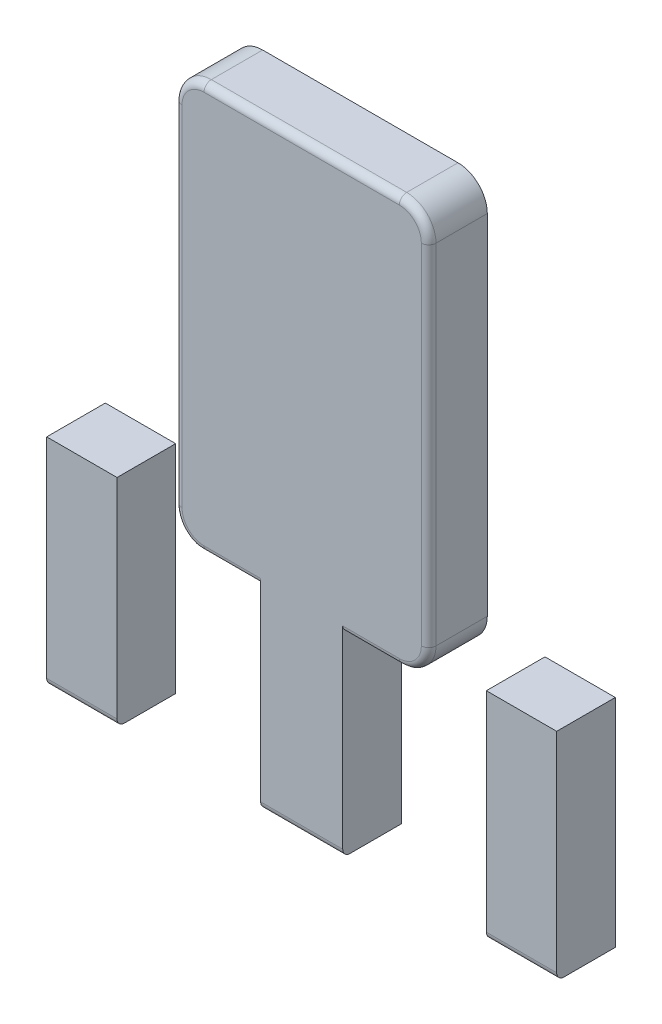
ISO-10303-21;
HEADER;
FILE_DESCRIPTION(('STEP AP214'),'2;1');
FILE_NAME('part.step','',(''),(''),'','','');
FILE_SCHEMA(('AUTOMOTIVE_DESIGN { 1 0 10303 214 1 1 1 1 }'));
ENDSEC;
DATA;
#1=APPLICATION_CONTEXT('core data for automotive mechanical design processes');
#2=APPLICATION_PROTOCOL_DEFINITION('international standard','automotive_design',2000,#1);
#3=PRODUCT_CONTEXT('',#1,'mechanical');
#4=PRODUCT('Part','Part','',(#3));
#5=PRODUCT_RELATED_PRODUCT_CATEGORY('part','',(#4));
#6=PRODUCT_DEFINITION_FORMATION('','',#4);
#7=PRODUCT_DEFINITION_CONTEXT('part definition',#1,'design');
#8=PRODUCT_DEFINITION('design','',#6,#7);
#9=PRODUCT_DEFINITION_SHAPE('','',#8);
#10=(LENGTH_UNIT() NAMED_UNIT(*) SI_UNIT(.MILLI.,.METRE.));
#11=(NAMED_UNIT(*) PLANE_ANGLE_UNIT() SI_UNIT($,.RADIAN.));
#12=(NAMED_UNIT(*) SI_UNIT($,.STERADIAN.) SOLID_ANGLE_UNIT());
#13=UNCERTAINTY_MEASURE_WITH_UNIT(LENGTH_MEASURE(1.E-05),#10,'distance_accuracy_value','');
#14=(GEOMETRIC_REPRESENTATION_CONTEXT(3) GLOBAL_UNCERTAINTY_ASSIGNED_CONTEXT((#13)) GLOBAL_UNIT_ASSIGNED_CONTEXT((#10,
#11,#12)) REPRESENTATION_CONTEXT('',''));
#15=CARTESIAN_POINT('',(0.,0.,0.));
#16=DIRECTION('',(0.,0.,1.));
#17=DIRECTION('',(1.,0.,0.));
#18=AXIS2_PLACEMENT_3D('',#15,#16,#17);
#19=CARTESIAN_POINT('',(27.87499984,24.870008478953,0.4));
#20=DIRECTION('',(0.,0.,1.));
#21=DIRECTION('',(1.,0.,0.));
#22=AXIS2_PLACEMENT_3D('',#19,#20,#21);
#23=PLANE('',#22);
#24=DIRECTION('',(1.,0.,0.));
#25=VECTOR('',#24,1.);
#26=CARTESIAN_POINT('',(27.87499984,23.53002147107,0.4));
#27=LINE('',#26,#25);
#28=CARTESIAN_POINT('',(27.20849984,23.53002147107,0.4));
#29=VERTEX_POINT('',#28);
#30=CARTESIAN_POINT('',(27.59499984,23.53002147107,0.4));
#31=VERTEX_POINT('',#30);
#32=EDGE_CURVE('P0_E169',#29,#31,#27,.T.);
#33=ORIENTED_EDGE('',*,*,#32,.T.);
#34=DIRECTION('',(0.,1.,0.));
#35=VECTOR('',#34,1.);
#36=CARTESIAN_POINT('',(27.59499984,24.870008478953,0.4));
#37=LINE('',#36,#35);
#38=CARTESIAN_POINT('',(27.59499984,22.209995486836,0.4));
#39=VERTEX_POINT('',#38);
#40=EDGE_CURVE('P0_E151',#31,#39,#37,.F.);
#41=ORIENTED_EDGE('',*,*,#40,.T.);
#42=DIRECTION('',(1.,0.,0.));
#43=VECTOR('',#42,1.);
#44=CARTESIAN_POINT('',(27.87499984,22.209995486836,0.4));
#45=LINE('',#44,#43);
#46=CARTESIAN_POINT('',(28.15499984,22.209995486836,0.4));
#47=VERTEX_POINT('',#46);
#48=EDGE_CURVE('P0_E144',#39,#47,#45,.T.);
#49=ORIENTED_EDGE('',*,*,#48,.T.);
#50=DIRECTION('',(0.,1.,0.));
#51=VECTOR('',#50,1.);
#52=CARTESIAN_POINT('',(28.15499984,24.870008478953,0.4));
#53=LINE('',#52,#51);
#54=CARTESIAN_POINT('',(28.15499984,23.53002147107,0.4));
#55=VERTEX_POINT('',#54);
#56=EDGE_CURVE('P0_E148',#47,#55,#53,.T.);
#57=ORIENTED_EDGE('',*,*,#56,.T.);
#58=DIRECTION('',(1.,0.,0.));
#59=VECTOR('',#58,1.);
#60=CARTESIAN_POINT('',(27.44174984,23.53002147107,0.4));
#61=LINE('',#60,#59);
#62=CARTESIAN_POINT('',(28.54149984,23.53002147107,0.4));
#63=VERTEX_POINT('',#62);
#64=EDGE_CURVE('P0_E176',#63,#55,#61,.F.);
#65=ORIENTED_EDGE('',*,*,#64,.F.);
#66=CARTESIAN_POINT('',(28.54149984,23.68002147107,0.4));
#67=DIRECTION('',(0.,0.,-1.));
#68=DIRECTION('',(1.,0.,0.));
#69=AXIS2_PLACEMENT_3D('',#66,#67,#68);
#70=CIRCLE('',#69,0.149999999999997);
#71=CARTESIAN_POINT('',(28.69149984,23.68002147107,0.4));
#72=VERTEX_POINT('',#71);
#73=EDGE_CURVE('P0_E512',#72,#63,#70,.T.);
#74=ORIENTED_EDGE('',*,*,#73,.F.);
#75=DIRECTION('',(0.,1.,0.));
#76=VECTOR('',#75,1.);
#77=CARTESIAN_POINT('',(28.69149984,24.175014975011,0.4));
#78=LINE('',#77,#76);
#79=CARTESIAN_POINT('',(28.69149984,26.059995486836,0.4));
#80=VERTEX_POINT('',#79);
#81=EDGE_CURVE('P0_E260',#80,#72,#78,.F.);
#82=ORIENTED_EDGE('',*,*,#81,.F.);
#83=CARTESIAN_POINT('',(28.54149984,26.059995486836,0.4));
#84=DIRECTION('',(0.,0.,-1.));
#85=DIRECTION('',(0.,1.,0.));
#86=AXIS2_PLACEMENT_3D('',#83,#84,#85);
#87=CIRCLE('',#86,0.150000000000001);
#88=CARTESIAN_POINT('',(28.54149984,26.209995486836,0.4));
#89=VERTEX_POINT('',#88);
#90=EDGE_CURVE('P0_E275',#89,#80,#87,.T.);
#91=ORIENTED_EDGE('',*,*,#90,.F.);
#92=DIRECTION('',(-1.,0.,0.));
#93=VECTOR('',#92,1.);
#94=CARTESIAN_POINT('',(28.30824984,26.209995486836,0.4));
#95=LINE('',#94,#93);
#96=CARTESIAN_POINT('',(27.20849984,26.209995486836,0.4));
#97=VERTEX_POINT('',#96);
#98=EDGE_CURVE('P0_E297',#97,#89,#95,.F.);
#99=ORIENTED_EDGE('',*,*,#98,.F.);
#100=CARTESIAN_POINT('',(27.20849984,26.059995486836,0.4));
#101=DIRECTION('',(0.,0.,-1.));
#102=DIRECTION('',(-1.,0.,0.));
#103=AXIS2_PLACEMENT_3D('',#100,#101,#102);
#104=CIRCLE('',#103,0.150000000000001);
#105=CARTESIAN_POINT('',(27.05849984,26.059995486836,0.4));
#106=VERTEX_POINT('',#105);
#107=EDGE_CURVE('P0_E543',#106,#97,#104,.T.);
#108=ORIENTED_EDGE('',*,*,#107,.F.);
#109=DIRECTION('',(0.,-1.,0.));
#110=VECTOR('',#109,1.);
#111=CARTESIAN_POINT('',(27.05849984,25.565001982894,0.4));
#112=LINE('',#111,#110);
#113=CARTESIAN_POINT('',(27.05849984,23.68002147107,0.4));
#114=VERTEX_POINT('',#113);
#115=EDGE_CURVE('P0_E234',#114,#106,#112,.F.);
#116=ORIENTED_EDGE('',*,*,#115,.F.);
#117=CARTESIAN_POINT('',(27.20849984,23.68002147107,0.4));
#118=DIRECTION('',(0.,0.,-1.));
#119=DIRECTION('',(0.,-1.,0.));
#120=AXIS2_PLACEMENT_3D('',#117,#118,#119);
#121=CIRCLE('',#120,0.149999999999997);
#122=EDGE_CURVE('P0_E167',#114,#29,#121,.F.);
#123=ORIENTED_EDGE('',*,*,#122,.T.);
#124=EDGE_LOOP('',(#33,#41,#49,#57,#65,#74,#82,#91,#99,#108,#116,#123));
#125=FACE_BOUND('',#124,.T.);
#126=ADVANCED_FACE('P0_F17',(#125),#23,.T.);
#127=CARTESIAN_POINT('',(27.44174984,23.53002147107,0.35));
#128=DIRECTION('',(1.,0.,0.));
#129=DIRECTION('',(0.,1.,0.));
#130=AXIS2_PLACEMENT_3D('',#127,#128,#129);
#131=CYLINDRICAL_SURFACE('',#130,0.05);
#132=ORIENTED_EDGE('',*,*,#64,.T.);
#133=CARTESIAN_POINT('',(28.15499984,23.53002147107,0.35));
#134=DIRECTION('',(1.,0.,0.));
#135=DIRECTION('',(0.,1.,0.));
#136=AXIS2_PLACEMENT_3D('',#133,#134,#135);
#137=CIRCLE('',#136,0.05);
#138=CARTESIAN_POINT('',(28.15499984,23.51002147107,0.395825756949779));
#139=VERTEX_POINT('',#138);
#140=EDGE_CURVE('P0_E166',#139,#55,#137,.F.);
#141=ORIENTED_EDGE('',*,*,#140,.F.);
#142=DIRECTION('',(1.,0.,0.));
#143=VECTOR('',#142,1.);
#144=CARTESIAN_POINT('',(28.15499984,23.51002147107,0.39582575695));
#145=LINE('',#144,#143);
#146=CARTESIAN_POINT('',(28.54149984,23.51002147107,0.395825756949779));
#147=VERTEX_POINT('',#146);
#148=EDGE_CURVE('P0_E327',#139,#147,#145,.T.);
#149=ORIENTED_EDGE('',*,*,#148,.T.);
#150=CARTESIAN_POINT('',(28.54149984,23.53002147107,0.35));
#151=DIRECTION('',(-1.,0.,0.));
#152=DIRECTION('',(0.,-1.,0.));
#153=AXIS2_PLACEMENT_3D('',#150,#151,#152);
#154=CIRCLE('',#153,0.05);
#155=EDGE_CURVE('P0_E268',#63,#147,#154,.F.);
#156=ORIENTED_EDGE('',*,*,#155,.F.);
#157=EDGE_LOOP('',(#132,#141,#149,#156));
#158=FACE_BOUND('',#157,.T.);
#159=ADVANCED_FACE('P0_F316',(#158),#131,.T.);
#160=CARTESIAN_POINT('',(28.54149984,23.68002147107,0.35));
#161=DIRECTION('',(0.,0.,-1.));
#162=DIRECTION('',(-1.,0.,0.));
#163=AXIS2_PLACEMENT_3D('',#160,#161,#162);
#164=TOROIDAL_SURFACE('',#163,0.150000000000001,0.05);
#165=ORIENTED_EDGE('',*,*,#73,.T.);
#166=ORIENTED_EDGE('',*,*,#155,.T.);
#167=CARTESIAN_POINT('',(28.54149984,23.51002147107,0.39582575694956));
#168=CARTESIAN_POINT('',(28.5454670463507,23.5100214710703,0.395823925661226));
#169=CARTESIAN_POINT('',(28.549433265949,23.5100214710701,0.39576557854478));
#170=CARTESIAN_POINT('',(28.557367116511,23.5100214710699,0.395518295345289));
#171=CARTESIAN_POINT('',(28.5613347416206,23.5100214710697,0.395329175797031));
#172=CARTESIAN_POINT('',(28.573373720192,23.5100214710706,0.394529786552662));
#173=CARTESIAN_POINT('',(28.5814350459597,23.510021471073,0.393686164947034));
#174=CARTESIAN_POINT('',(28.5943958248497,23.510021471072,0.39147124781918));
#175=CARTESIAN_POINT('',(28.5993461998738,23.5100214710705,0.390416929183707));
#176=CARTESIAN_POINT('',(28.6090662806014,23.5100214710695,0.38773144048353));
#177=CARTESIAN_POINT('',(28.6138367690784,23.51002147107,0.386103195317195));
#178=CARTESIAN_POINT('',(28.6237453393678,23.5100214710704,0.381715010684801));
#179=CARTESIAN_POINT('',(28.628831020054,23.5100214710701,0.378821829297902));
#180=CARTESIAN_POINT('',(28.6366839229633,23.5100214710699,0.372404905570367));
#181=CARTESIAN_POINT('',(28.6397120957729,23.51002147107,0.369226620121918));
#182=CARTESIAN_POINT('',(28.6438482586086,23.51002147107,0.362776914775868));
#183=CARTESIAN_POINT('',(28.6452393854319,23.51002147107,0.359700146098907));
#184=CARTESIAN_POINT('',(28.6465872508968,23.51002147107,0.354370083119612));
#185=CARTESIAN_POINT('',(28.6468718238064,23.51002147107,0.352194992673776));
#186=CARTESIAN_POINT('',(28.6468563775285,23.51002147107,0.35));
#187=B_SPLINE_CURVE_WITH_KNOTS('',3,(#167,#168,#169,#170,#171,#172,#173,#174,#175,#176,#177,
#178,#179,#180,#181,#182,#183,#184,#185,#186),.UNSPECIFIED.,.F.,.F.,(4,2,2,2,2,2,2,2,2,4),(0.,
0.011898983462492,0.0238146943840628,0.0480839145131784,0.0632424571003176,0.0783248383911586,
0.0956724692605174,0.10862506220778,0.118556370768383,0.125091474785209),.UNSPECIFIED.);
#188=CARTESIAN_POINT('',(28.6468563775287,23.5100214710701,0.35));
#189=VERTEX_POINT('',#188);
#190=EDGE_CURVE('P0_E320',#147,#189,#187,.T.);
#191=ORIENTED_EDGE('',*,*,#190,.T.);
#192=CARTESIAN_POINT('',(28.54149984,23.68002147107,0.35));
#193=DIRECTION('',(0.,0.,1.));
#194=DIRECTION('',(1.,0.,0.));
#195=AXIS2_PLACEMENT_3D('',#192,#193,#194);
#196=CIRCLE('',#195,0.2);
#197=CARTESIAN_POINT('',(28.74149984,23.68002147107,0.35));
#198=VERTEX_POINT('',#197);
#199=EDGE_CURVE('P0_E300',#198,#189,#196,.F.);
#200=ORIENTED_EDGE('',*,*,#199,.F.);
#201=CARTESIAN_POINT('',(28.69149984,23.68002147107,0.35));
#202=DIRECTION('',(0.,1.,0.));
#203=DIRECTION('',(-1.,0.,0.));
#204=AXIS2_PLACEMENT_3D('',#201,#202,#203);
#205=CIRCLE('',#204,0.05);
#206=EDGE_CURVE('P0_E267',#72,#198,#205,.T.);
#207=ORIENTED_EDGE('',*,*,#206,.F.);
#208=EDGE_LOOP('',(#165,#166,#191,#200,#207));
#209=FACE_BOUND('',#208,.T.);
#210=ADVANCED_FACE('P0_F313',(#209),#164,.T.);
#211=CARTESIAN_POINT('',(28.69149984,24.175014975011,0.35));
#212=DIRECTION('',(0.,1.,0.));
#213=DIRECTION('',(-1.,0.,0.));
#214=AXIS2_PLACEMENT_3D('',#211,#212,#213);
#215=CYLINDRICAL_SURFACE('',#214,0.05);
#216=ORIENTED_EDGE('',*,*,#206,.T.);
#217=DIRECTION('',(0.,1.,0.));
#218=VECTOR('',#217,1.);
#219=CARTESIAN_POINT('',(28.74149984,23.48002147107,0.35));
#220=LINE('',#219,#218);
#221=CARTESIAN_POINT('',(28.74149984,26.059995486836,0.35));
#222=VERTEX_POINT('',#221);
#223=EDGE_CURVE('P0_E303',#222,#198,#220,.F.);
#224=ORIENTED_EDGE('',*,*,#223,.F.);
#225=CARTESIAN_POINT('',(28.69149984,26.059995486836,0.35));
#226=DIRECTION('',(0.,-1.,0.));
#227=DIRECTION('',(1.,0.,0.));
#228=AXIS2_PLACEMENT_3D('',#225,#226,#227);
#229=CIRCLE('',#228,0.05);
#230=EDGE_CURVE('P0_E295',#80,#222,#229,.F.);
#231=ORIENTED_EDGE('',*,*,#230,.F.);
#232=ORIENTED_EDGE('',*,*,#81,.T.);
#233=EDGE_LOOP('',(#216,#224,#231,#232));
#234=FACE_BOUND('',#233,.T.);
#235=ADVANCED_FACE('P0_F289',(#234),#215,.T.);
#236=CARTESIAN_POINT('',(28.54149984,26.059995486836,0.35));
#237=DIRECTION('',(0.,0.,-1.));
#238=DIRECTION('',(-1.,0.,0.));
#239=AXIS2_PLACEMENT_3D('',#236,#237,#238);
#240=TOROIDAL_SURFACE('',#239,0.150000000000001,0.05);
#241=ORIENTED_EDGE('',*,*,#230,.T.);
#242=CARTESIAN_POINT('',(28.54149984,26.059995486836,0.35));
#243=DIRECTION('',(0.,0.,1.));
#244=DIRECTION('',(1.,0.,0.));
#245=AXIS2_PLACEMENT_3D('',#242,#243,#244);
#246=CIRCLE('',#245,0.2);
#247=CARTESIAN_POINT('',(28.54149984,26.259995486836,0.35));
#248=VERTEX_POINT('',#247);
#249=EDGE_CURVE('P0_E455',#248,#222,#246,.F.);
#250=ORIENTED_EDGE('',*,*,#249,.F.);
#251=CARTESIAN_POINT('',(28.54149984,26.209995486836,0.35));
#252=DIRECTION('',(-1.,0.,0.));
#253=DIRECTION('',(0.,-1.,0.));
#254=AXIS2_PLACEMENT_3D('',#251,#252,#253);
#255=CIRCLE('',#254,0.05);
#256=EDGE_CURVE('P0_E564',#89,#248,#255,.T.);
#257=ORIENTED_EDGE('',*,*,#256,.F.);
#258=ORIENTED_EDGE('',*,*,#90,.T.);
#259=EDGE_LOOP('',(#241,#250,#257,#258));
#260=FACE_BOUND('',#259,.T.);
#261=ADVANCED_FACE('P0_F279',(#260),#240,.T.);
#262=CARTESIAN_POINT('',(28.30824984,26.209995486836,0.35));
#263=DIRECTION('',(-1.,0.,0.));
#264=DIRECTION('',(0.,-1.,0.));
#265=AXIS2_PLACEMENT_3D('',#262,#263,#264);
#266=CYLINDRICAL_SURFACE('',#265,0.05);
#267=ORIENTED_EDGE('',*,*,#256,.T.);
#268=DIRECTION('',(-1.,0.,0.));
#269=VECTOR('',#268,1.);
#270=CARTESIAN_POINT('',(28.74149984,26.259995486836,0.35));
#271=LINE('',#270,#269);
#272=CARTESIAN_POINT('',(27.20849984,26.259995486836,0.35));
#273=VERTEX_POINT('',#272);
#274=EDGE_CURVE('P0_E237',#273,#248,#271,.F.);
#275=ORIENTED_EDGE('',*,*,#274,.F.);
#276=CARTESIAN_POINT('',(27.20849984,26.209995486836,0.35));
#277=DIRECTION('',(1.,0.,0.));
#278=DIRECTION('',(0.,1.,0.));
#279=AXIS2_PLACEMENT_3D('',#276,#277,#278);
#280=CIRCLE('',#279,0.05);
#281=EDGE_CURVE('P0_E245',#97,#273,#280,.F.);
#282=ORIENTED_EDGE('',*,*,#281,.F.);
#283=ORIENTED_EDGE('',*,*,#98,.T.);
#284=EDGE_LOOP('',(#267,#275,#282,#283));
#285=FACE_BOUND('',#284,.T.);
#286=ADVANCED_FACE('P0_F251',(#285),#266,.T.);
#287=CARTESIAN_POINT('',(27.20849984,26.059995486836,0.35));
#288=DIRECTION('',(0.,0.,-1.));
#289=DIRECTION('',(-1.,0.,0.));
#290=AXIS2_PLACEMENT_3D('',#287,#288,#289);
#291=TOROIDAL_SURFACE('',#290,0.150000000000001,0.05);
#292=ORIENTED_EDGE('',*,*,#281,.T.);
#293=CARTESIAN_POINT('',(27.20849984,26.059995486836,0.35));
#294=DIRECTION('',(0.,0.,1.));
#295=DIRECTION('',(1.,0.,0.));
#296=AXIS2_PLACEMENT_3D('',#293,#294,#295);
#297=CIRCLE('',#296,0.2);
#298=CARTESIAN_POINT('',(27.00849984,26.059995486836,0.35));
#299=VERTEX_POINT('',#298);
#300=EDGE_CURVE('P0_E227',#299,#273,#297,.F.);
#301=ORIENTED_EDGE('',*,*,#300,.F.);
#302=CARTESIAN_POINT('',(27.05849984,26.059995486836,0.35));
#303=DIRECTION('',(0.,-1.,0.));
#304=DIRECTION('',(1.,0.,0.));
#305=AXIS2_PLACEMENT_3D('',#302,#303,#304);
#306=CIRCLE('',#305,0.05);
#307=EDGE_CURVE('P0_E224',#106,#299,#306,.T.);
#308=ORIENTED_EDGE('',*,*,#307,.F.);
#309=ORIENTED_EDGE('',*,*,#107,.T.);
#310=EDGE_LOOP('',(#292,#301,#308,#309));
#311=FACE_BOUND('',#310,.T.);
#312=ADVANCED_FACE('P0_F247',(#311),#291,.T.);
#313=CARTESIAN_POINT('',(27.05849984,25.565001982894,0.35));
#314=DIRECTION('',(0.,-1.,0.));
#315=DIRECTION('',(1.,0.,0.));
#316=AXIS2_PLACEMENT_3D('',#313,#314,#315);
#317=CYLINDRICAL_SURFACE('',#316,0.05);
#318=ORIENTED_EDGE('',*,*,#307,.T.);
#319=DIRECTION('',(0.,-1.,0.));
#320=VECTOR('',#319,1.);
#321=CARTESIAN_POINT('',(27.00849984,26.259995486836,0.35));
#322=LINE('',#321,#320);
#323=CARTESIAN_POINT('',(27.00849984,23.68002147107,0.35));
#324=VERTEX_POINT('',#323);
#325=EDGE_CURVE('P0_E215',#324,#299,#322,.F.);
#326=ORIENTED_EDGE('',*,*,#325,.F.);
#327=CARTESIAN_POINT('',(27.05849984,23.68002147107,0.35));
#328=DIRECTION('',(0.,1.,0.));
#329=DIRECTION('',(-1.,0.,0.));
#330=AXIS2_PLACEMENT_3D('',#327,#328,#329);
#331=CIRCLE('',#330,0.05);
#332=EDGE_CURVE('P0_E221',#114,#324,#331,.F.);
#333=ORIENTED_EDGE('',*,*,#332,.F.);
#334=ORIENTED_EDGE('',*,*,#115,.T.);
#335=EDGE_LOOP('',(#318,#326,#333,#334));
#336=FACE_BOUND('',#335,.T.);
#337=ADVANCED_FACE('P0_F199',(#336),#317,.T.);
#338=CARTESIAN_POINT('',(27.20849984,23.68002147107,0.35));
#339=DIRECTION('',(0.,0.,-1.));
#340=DIRECTION('',(-1.,0.,0.));
#341=AXIS2_PLACEMENT_3D('',#338,#339,#340);
#342=TOROIDAL_SURFACE('',#341,0.150000000000001,0.05);
#343=ORIENTED_EDGE('',*,*,#332,.T.);
#344=CARTESIAN_POINT('',(27.20849984,23.68002147107,0.35));
#345=DIRECTION('',(0.,0.,1.));
#346=DIRECTION('',(1.,0.,0.));
#347=AXIS2_PLACEMENT_3D('',#344,#345,#346);
#348=CIRCLE('',#347,0.2);
#349=CARTESIAN_POINT('',(27.1031433024712,23.51002147107,0.35));
#350=VERTEX_POINT('',#349);
#351=EDGE_CURVE('P0_E208',#350,#324,#348,.F.);
#352=ORIENTED_EDGE('',*,*,#351,.F.);
#353=CARTESIAN_POINT('',(27.1031433024715,23.51002147107,0.35));
#354=CARTESIAN_POINT('',(27.1031181051512,23.51002147107,0.35313881546828));
#355=CARTESIAN_POINT('',(27.1036982612725,23.51002147107,0.356201353341664));
#356=CARTESIAN_POINT('',(27.1057756542494,23.51002147107,0.361996908477458));
#357=CARTESIAN_POINT('',(27.1072692396793,23.51002147107,0.364731186155528));
#358=CARTESIAN_POINT('',(27.1118848929716,23.51002147107,0.371101914034418));
#359=CARTESIAN_POINT('',(27.1154507453115,23.51002147107,0.374399837475452));
#360=CARTESIAN_POINT('',(27.1225000186428,23.51002147107,0.379452995833241));
#361=CARTESIAN_POINT('',(27.1258730396514,23.51002147107,0.381381662009323));
#362=CARTESIAN_POINT('',(27.132891415033,23.51002147107,0.384741875614142));
#363=CARTESIAN_POINT('',(27.1365388720196,23.51002147107,0.386168980374011));
#364=CARTESIAN_POINT('',(27.1458626233454,23.51002147107,0.389253734638291));
#365=CARTESIAN_POINT('',(27.1516203728115,23.51002147107,0.390654486589262));
#366=CARTESIAN_POINT('',(27.1632625393431,23.51002147107,0.392859347211519));
#367=CARTESIAN_POINT('',(27.1691473933054,23.51002147107,0.393660874762383));
#368=CARTESIAN_POINT('',(27.180632359305,23.51002147107,0.394827565118396));
#369=CARTESIAN_POINT('',(27.18623045657,23.51002147107,0.39521418147571));
#370=CARTESIAN_POINT('',(27.1973869996319,23.51002147107,0.395706358913322));
#371=CARTESIAN_POINT('',(27.202945324381,23.51002147107,0.395814524089981));
#372=CARTESIAN_POINT('',(27.20849984,23.51002147107,0.39582575694956));
#373=B_SPLINE_CURVE_WITH_KNOTS('',3,(#353,#354,#355,#356,#357,#358,#359,#360,#361,#362,#363,
#364,#365,#366,#367,#368,#369,#370,#371,#372),.UNSPECIFIED.,.F.,.F.,(4,2,2,2,2,2,2,2,2,4),(0.,
0.00924367209698654,0.0184506320601541,0.032754510017067,0.0443707872529733,0.0560875077121733,
0.073811079442636,0.0916105612814064,0.108437297404244,0.125106087256074),.UNSPECIFIED.);
#374=CARTESIAN_POINT('',(27.20849984,23.51002147107,0.395825756949779));
#375=VERTEX_POINT('',#374);
#376=EDGE_CURVE('P0_E328',#350,#375,#373,.T.);
#377=ORIENTED_EDGE('',*,*,#376,.T.);
#378=CARTESIAN_POINT('',(27.20849984,23.53002147107,0.35));
#379=DIRECTION('',(1.,0.,0.));
#380=DIRECTION('',(0.,1.,0.));
#381=AXIS2_PLACEMENT_3D('',#378,#379,#380);
#382=CIRCLE('',#381,0.05);
#383=EDGE_CURVE('P0_E223',#29,#375,#382,.T.);
#384=ORIENTED_EDGE('',*,*,#383,.F.);
#385=ORIENTED_EDGE('',*,*,#122,.F.);
#386=EDGE_LOOP('',(#343,#352,#377,#384,#385));
#387=FACE_BOUND('',#386,.T.);
#388=ADVANCED_FACE('P0_F188',(#387),#342,.T.);
#389=CARTESIAN_POINT('',(27.73499984,22.209995486836,0.35));
#390=DIRECTION('',(1.,0.,0.));
#391=DIRECTION('',(0.,1.,0.));
#392=AXIS2_PLACEMENT_3D('',#389,#390,#391);
#393=CYLINDRICAL_SURFACE('',#392,0.05);
#394=CARTESIAN_POINT('',(27.59499984,22.209995486836,0.35));
#395=DIRECTION('',(1.,0.,0.));
#396=DIRECTION('',(0.,1.,0.));
#397=AXIS2_PLACEMENT_3D('',#394,#395,#396);
#398=CIRCLE('',#397,0.05);
#399=CARTESIAN_POINT('',(27.59499984,22.159995486836,0.35));
#400=VERTEX_POINT('',#399);
#401=EDGE_CURVE('P0_E431',#400,#39,#398,.F.);
#402=ORIENTED_EDGE('',*,*,#401,.F.);
#403=DIRECTION('',(1.,0.,0.));
#404=VECTOR('',#403,1.);
#405=CARTESIAN_POINT('',(27.59499984,22.159995486836,0.35));
#406=LINE('',#405,#404);
#407=CARTESIAN_POINT('',(28.15499984,22.159995486836,0.35));
#408=VERTEX_POINT('',#407);
#409=EDGE_CURVE('P0_E159',#408,#400,#406,.F.);
#410=ORIENTED_EDGE('',*,*,#409,.F.);
#411=CARTESIAN_POINT('',(28.15499984,22.209995486836,0.35));
#412=DIRECTION('',(1.,0.,0.));
#413=DIRECTION('',(0.,1.,0.));
#414=AXIS2_PLACEMENT_3D('',#411,#412,#413);
#415=CIRCLE('',#414,0.05);
#416=EDGE_CURVE('P0_E21',#47,#408,#415,.T.);
#417=ORIENTED_EDGE('',*,*,#416,.F.);
#418=ORIENTED_EDGE('',*,*,#48,.F.);
#419=EDGE_LOOP('',(#402,#410,#417,#418));
#420=FACE_BOUND('',#419,.T.);
#421=ADVANCED_FACE('P0_F158',(#420),#393,.T.);
#422=CARTESIAN_POINT('',(27.44174984,23.53002147107,0.35));
#423=DIRECTION('',(1.,0.,0.));
#424=DIRECTION('',(0.,1.,0.));
#425=AXIS2_PLACEMENT_3D('',#422,#423,#424);
#426=CYLINDRICAL_SURFACE('',#425,0.05);
#427=ORIENTED_EDGE('',*,*,#32,.F.);
#428=ORIENTED_EDGE('',*,*,#383,.T.);
#429=DIRECTION('',(1.,0.,0.));
#430=VECTOR('',#429,1.);
#431=CARTESIAN_POINT('',(26.99499984,23.51002147107,0.39582575695));
#432=LINE('',#431,#430);
#433=CARTESIAN_POINT('',(27.59499984,23.51002147107,0.395825756949779));
#434=VERTEX_POINT('',#433);
#435=EDGE_CURVE('P0_E432',#375,#434,#432,.T.);
#436=ORIENTED_EDGE('',*,*,#435,.T.);
#437=CARTESIAN_POINT('',(27.59499984,23.53002147107,0.35));
#438=DIRECTION('',(1.,0.,0.));
#439=DIRECTION('',(0.,1.,0.));
#440=AXIS2_PLACEMENT_3D('',#437,#438,#439);
#441=CIRCLE('',#440,0.05);
#442=EDGE_CURVE('P0_E425',#31,#434,#441,.T.);
#443=ORIENTED_EDGE('',*,*,#442,.F.);
#444=EDGE_LOOP('',(#427,#428,#436,#443));
#445=FACE_BOUND('',#444,.T.);
#446=ADVANCED_FACE('P0_F347',(#445),#426,.T.);
#447=CARTESIAN_POINT('',(27.59499984,22.159995486836,0.));
#448=DIRECTION('',(0.,-1.,0.));
#449=DIRECTION('',(1.,0.,0.));
#450=AXIS2_PLACEMENT_3D('',#447,#448,#449);
#451=PLANE('',#450);
#452=DIRECTION('',(1.,0.,0.));
#453=VECTOR('',#452,1.);
#454=CARTESIAN_POINT('',(27.87499984,22.159995486836,0.));
#455=LINE('',#454,#453);
#456=CARTESIAN_POINT('',(27.59499984,22.159995486836,0.));
#457=VERTEX_POINT('',#456);
#458=CARTESIAN_POINT('',(28.15499984,22.159995486836,0.));
#459=VERTEX_POINT('',#458);
#460=EDGE_CURVE('P0_E424',#457,#459,#455,.T.);
#461=ORIENTED_EDGE('',*,*,#460,.T.);
#462=DIRECTION('',(0.,0.,1.));
#463=VECTOR('',#462,1.);
#464=CARTESIAN_POINT('',(28.15499984,22.159995486836,0.));
#465=LINE('',#464,#463);
#466=EDGE_CURVE('P0_E162',#408,#459,#465,.F.);
#467=ORIENTED_EDGE('',*,*,#466,.F.);
#468=ORIENTED_EDGE('',*,*,#409,.T.);
#469=DIRECTION('',(0.,0.,1.));
#470=VECTOR('',#469,1.);
#471=CARTESIAN_POINT('',(27.59499984,22.159995486836,0.));
#472=LINE('',#471,#470);
#473=EDGE_CURVE('P0_E428',#457,#400,#472,.T.);
#474=ORIENTED_EDGE('',*,*,#473,.F.);
#475=EDGE_LOOP('',(#461,#467,#468,#474));
#476=FACE_BOUND('',#475,.T.);
#477=ADVANCED_FACE('P0_F345',(#476),#451,.T.);
#478=CARTESIAN_POINT('',(28.15499984,22.159995486836,0.));
#479=DIRECTION('',(1.,0.,0.));
#480=DIRECTION('',(0.,1.,0.));
#481=AXIS2_PLACEMENT_3D('',#478,#479,#480);
#482=PLANE('',#481);
#483=DIRECTION('',(0.,0.,1.));
#484=VECTOR('',#483,1.);
#485=CARTESIAN_POINT('',(28.15499984,23.51002147107,0.));
#486=LINE('',#485,#484);
#487=CARTESIAN_POINT('',(28.15499984,23.51002147107,0.));
#488=VERTEX_POINT('',#487);
#489=EDGE_CURVE('P0_E464',#488,#139,#486,.T.);
#490=ORIENTED_EDGE('',*,*,#489,.T.);
#491=ORIENTED_EDGE('',*,*,#140,.T.);
#492=ORIENTED_EDGE('',*,*,#56,.F.);
#493=ORIENTED_EDGE('',*,*,#416,.T.);
#494=ORIENTED_EDGE('',*,*,#466,.T.);
#495=DIRECTION('',(0.,1.,0.));
#496=VECTOR('',#495,1.);
#497=CARTESIAN_POINT('',(28.15499984,22.898495486836,0.));
#498=LINE('',#497,#496);
#499=EDGE_CURVE('P0_E420',#459,#488,#498,.T.);
#500=ORIENTED_EDGE('',*,*,#499,.T.);
#501=EDGE_LOOP('',(#490,#491,#492,#493,#494,#500));
#502=FACE_BOUND('',#501,.T.);
#503=ADVANCED_FACE('P0_F165',(#502),#482,.T.);
#504=CARTESIAN_POINT('',(28.15499984,23.51002147107,0.));
#505=DIRECTION('',(0.,1.,0.));
#506=DIRECTION('',(0.,0.,1.));
#507=AXIS2_PLACEMENT_3D('',#504,#505,#506);
#508=PLANE('',#507);
#509=DIRECTION('',(0.,0.,1.));
#510=VECTOR('',#509,1.);
#511=CARTESIAN_POINT('',(28.6468563775289,23.5100214710702,0.));
#512=LINE('',#511,#510);
#513=CARTESIAN_POINT('',(28.6468563775287,23.5100214710701,0.));
#514=VERTEX_POINT('',#513);
#515=EDGE_CURVE('P0_E304',#189,#514,#512,.F.);
#516=ORIENTED_EDGE('',*,*,#515,.F.);
#517=ORIENTED_EDGE('',*,*,#190,.F.);
#518=ORIENTED_EDGE('',*,*,#148,.F.);
#519=ORIENTED_EDGE('',*,*,#489,.F.);
#520=DIRECTION('',(1.,0.,0.));
#521=VECTOR('',#520,1.);
#522=CARTESIAN_POINT('',(27.87499984,23.51002147107,0.));
#523=LINE('',#522,#521);
#524=EDGE_CURVE('P0_E413',#488,#514,#523,.T.);
#525=ORIENTED_EDGE('',*,*,#524,.T.);
#526=EDGE_LOOP('',(#516,#517,#518,#519,#525));
#527=FACE_BOUND('',#526,.T.);
#528=ADVANCED_FACE('P0_F335',(#527),#508,.F.);
#529=CARTESIAN_POINT('',(28.54149984,23.68002147107,0.));
#530=DIRECTION('',(0.,0.,1.));
#531=DIRECTION('',(1.,0.,0.));
#532=AXIS2_PLACEMENT_3D('',#529,#530,#531);
#533=CYLINDRICAL_SURFACE('',#532,0.2);
#534=DIRECTION('',(0.,0.,1.));
#535=VECTOR('',#534,1.);
#536=CARTESIAN_POINT('',(28.74149984,23.68002147107,0.));
#537=LINE('',#536,#535);
#538=CARTESIAN_POINT('',(28.74149984,23.68002147107,0.));
#539=VERTEX_POINT('',#538);
#540=EDGE_CURVE('P0_E403',#198,#539,#537,.F.);
#541=ORIENTED_EDGE('',*,*,#540,.F.);
#542=ORIENTED_EDGE('',*,*,#199,.T.);
#543=ORIENTED_EDGE('',*,*,#515,.T.);
#544=CARTESIAN_POINT('',(28.54149984,23.68002147107,0.));
#545=DIRECTION('',(0.,0.,1.));
#546=DIRECTION('',(1.,0.,0.));
#547=AXIS2_PLACEMENT_3D('',#544,#545,#546);
#548=CIRCLE('',#547,0.2);
#549=EDGE_CURVE('P0_E408',#514,#539,#548,.T.);
#550=ORIENTED_EDGE('',*,*,#549,.T.);
#551=EDGE_LOOP('',(#541,#542,#543,#550));
#552=FACE_BOUND('',#551,.T.);
#553=ADVANCED_FACE('P0_F340',(#552),#533,.T.);
#554=CARTESIAN_POINT('',(28.74149984,23.48002147107,0.));
#555=DIRECTION('',(1.,0.,0.));
#556=DIRECTION('',(0.,1.,0.));
#557=AXIS2_PLACEMENT_3D('',#554,#555,#556);
#558=PLANE('',#557);
#559=DIRECTION('',(0.,1.,0.));
#560=VECTOR('',#559,1.);
#561=CARTESIAN_POINT('',(28.74149984,22.898495486836,0.));
#562=LINE('',#561,#560);
#563=CARTESIAN_POINT('',(28.74149984,26.059995486836,0.));
#564=VERTEX_POINT('',#563);
#565=EDGE_CURVE('P0_E400',#539,#564,#562,.T.);
#566=ORIENTED_EDGE('',*,*,#565,.T.);
#567=DIRECTION('',(0.,0.,1.));
#568=VECTOR('',#567,1.);
#569=CARTESIAN_POINT('',(28.74149984,26.059995486836,0.));
#570=LINE('',#569,#568);
#571=EDGE_CURVE('P0_E240',#222,#564,#570,.F.);
#572=ORIENTED_EDGE('',*,*,#571,.F.);
#573=ORIENTED_EDGE('',*,*,#223,.T.);
#574=ORIENTED_EDGE('',*,*,#540,.T.);
#575=EDGE_LOOP('',(#566,#572,#573,#574));
#576=FACE_BOUND('',#575,.T.);
#577=ADVANCED_FACE('P0_F389',(#576),#558,.T.);
#578=CARTESIAN_POINT('',(28.54149984,26.059995486836,0.));
#579=DIRECTION('',(0.,0.,1.));
#580=DIRECTION('',(1.,0.,0.));
#581=AXIS2_PLACEMENT_3D('',#578,#579,#580);
#582=CYLINDRICAL_SURFACE('',#581,0.2);
#583=CARTESIAN_POINT('',(28.54149984,26.059995486836,0.));
#584=DIRECTION('',(0.,0.,1.));
#585=DIRECTION('',(1.,0.,0.));
#586=AXIS2_PLACEMENT_3D('',#583,#584,#585);
#587=CIRCLE('',#586,0.2);
#588=CARTESIAN_POINT('',(28.54149984,26.259995486836,0.));
#589=VERTEX_POINT('',#588);
#590=EDGE_CURVE('P0_E407',#564,#589,#587,.T.);
#591=ORIENTED_EDGE('',*,*,#590,.T.);
#592=DIRECTION('',(0.,0.,1.));
#593=VECTOR('',#592,1.);
#594=CARTESIAN_POINT('',(28.54149984,26.259995486836,0.));
#595=LINE('',#594,#593);
#596=EDGE_CURVE('P0_E230',#248,#589,#595,.F.);
#597=ORIENTED_EDGE('',*,*,#596,.F.);
#598=ORIENTED_EDGE('',*,*,#249,.T.);
#599=ORIENTED_EDGE('',*,*,#571,.T.);
#600=EDGE_LOOP('',(#591,#597,#598,#599));
#601=FACE_BOUND('',#600,.T.);
#602=ADVANCED_FACE('P0_F386',(#601),#582,.T.);
#603=CARTESIAN_POINT('',(28.74149984,26.259995486836,0.));
#604=DIRECTION('',(0.,1.,0.));
#605=DIRECTION('',(-1.,0.,0.));
#606=AXIS2_PLACEMENT_3D('',#603,#604,#605);
#607=PLANE('',#606);
#608=DIRECTION('',(1.,0.,0.));
#609=VECTOR('',#608,1.);
#610=CARTESIAN_POINT('',(27.87499984,26.259995486836,0.));
#611=LINE('',#610,#609);
#612=CARTESIAN_POINT('',(27.20849984,26.259995486836,0.));
#613=VERTEX_POINT('',#612);
#614=EDGE_CURVE('P0_E411',#589,#613,#611,.F.);
#615=ORIENTED_EDGE('',*,*,#614,.T.);
#616=DIRECTION('',(0.,0.,1.));
#617=VECTOR('',#616,1.);
#618=CARTESIAN_POINT('',(27.20849984,26.259995486836,0.));
#619=LINE('',#618,#617);
#620=EDGE_CURVE('P0_E218',#273,#613,#619,.F.);
#621=ORIENTED_EDGE('',*,*,#620,.F.);
#622=ORIENTED_EDGE('',*,*,#274,.T.);
#623=ORIENTED_EDGE('',*,*,#596,.T.);
#624=EDGE_LOOP('',(#615,#621,#622,#623));
#625=FACE_BOUND('',#624,.T.);
#626=ADVANCED_FACE('P0_F382',(#625),#607,.T.);
#627=CARTESIAN_POINT('',(27.20849984,26.059995486836,0.));
#628=DIRECTION('',(0.,0.,1.));
#629=DIRECTION('',(1.,0.,0.));
#630=AXIS2_PLACEMENT_3D('',#627,#628,#629);
#631=CYLINDRICAL_SURFACE('',#630,0.2);
#632=CARTESIAN_POINT('',(27.20849984,26.059995486836,0.));
#633=DIRECTION('',(0.,0.,1.));
#634=DIRECTION('',(1.,0.,0.));
#635=AXIS2_PLACEMENT_3D('',#632,#633,#634);
#636=CIRCLE('',#635,0.2);
#637=CARTESIAN_POINT('',(27.00849984,26.059995486836,0.));
#638=VERTEX_POINT('',#637);
#639=EDGE_CURVE('P0_E498',#613,#638,#636,.T.);
#640=ORIENTED_EDGE('',*,*,#639,.T.);
#641=DIRECTION('',(0.,0.,1.));
#642=VECTOR('',#641,1.);
#643=CARTESIAN_POINT('',(27.00849984,26.059995486836,0.));
#644=LINE('',#643,#642);
#645=EDGE_CURVE('P0_E212',#299,#638,#644,.F.);
#646=ORIENTED_EDGE('',*,*,#645,.F.);
#647=ORIENTED_EDGE('',*,*,#300,.T.);
#648=ORIENTED_EDGE('',*,*,#620,.T.);
#649=EDGE_LOOP('',(#640,#646,#647,#648));
#650=FACE_BOUND('',#649,.T.);
#651=ADVANCED_FACE('P0_F378',(#650),#631,.T.);
#652=CARTESIAN_POINT('',(27.00849984,26.259995486836,0.));
#653=DIRECTION('',(-1.,0.,0.));
#654=DIRECTION('',(0.,-1.,0.));
#655=AXIS2_PLACEMENT_3D('',#652,#653,#654);
#656=PLANE('',#655);
#657=DIRECTION('',(0.,1.,0.));
#658=VECTOR('',#657,1.);
#659=CARTESIAN_POINT('',(27.00849984,22.898495486836,0.));
#660=LINE('',#659,#658);
#661=CARTESIAN_POINT('',(27.00849984,23.68002147107,0.));
#662=VERTEX_POINT('',#661);
#663=EDGE_CURVE('P0_E494',#638,#662,#660,.F.);
#664=ORIENTED_EDGE('',*,*,#663,.T.);
#665=DIRECTION('',(0.,0.,1.));
#666=VECTOR('',#665,1.);
#667=CARTESIAN_POINT('',(27.00849984,23.68002147107,0.));
#668=LINE('',#667,#666);
#669=EDGE_CURVE('P0_E211',#324,#662,#668,.F.);
#670=ORIENTED_EDGE('',*,*,#669,.F.);
#671=ORIENTED_EDGE('',*,*,#325,.T.);
#672=ORIENTED_EDGE('',*,*,#645,.T.);
#673=EDGE_LOOP('',(#664,#670,#671,#672));
#674=FACE_BOUND('',#673,.T.);
#675=ADVANCED_FACE('P0_F374',(#674),#656,.T.);
#676=CARTESIAN_POINT('',(27.20849984,23.68002147107,0.));
#677=DIRECTION('',(0.,0.,1.));
#678=DIRECTION('',(1.,0.,0.));
#679=AXIS2_PLACEMENT_3D('',#676,#677,#678);
#680=CYLINDRICAL_SURFACE('',#679,0.2);
#681=ORIENTED_EDGE('',*,*,#669,.T.);
#682=CARTESIAN_POINT('',(27.20849984,23.68002147107,0.));
#683=DIRECTION('',(0.,0.,1.));
#684=DIRECTION('',(1.,0.,0.));
#685=AXIS2_PLACEMENT_3D('',#682,#683,#684);
#686=CIRCLE('',#685,0.2);
#687=CARTESIAN_POINT('',(27.1031433024712,23.51002147107,0.));
#688=VERTEX_POINT('',#687);
#689=EDGE_CURVE('P0_E186',#662,#688,#686,.T.);
#690=ORIENTED_EDGE('',*,*,#689,.T.);
#691=DIRECTION('',(0.,0.,1.));
#692=VECTOR('',#691,1.);
#693=CARTESIAN_POINT('',(27.103143302471,23.51002147107,0.));
#694=LINE('',#693,#692);
#695=EDGE_CURVE('P0_E437',#688,#350,#694,.T.);
#696=ORIENTED_EDGE('',*,*,#695,.T.);
#697=ORIENTED_EDGE('',*,*,#351,.T.);
#698=EDGE_LOOP('',(#681,#690,#696,#697));
#699=FACE_BOUND('',#698,.T.);
#700=ADVANCED_FACE('P0_F370',(#699),#680,.T.);
#701=CARTESIAN_POINT('',(26.99499984,23.51002147107,0.));
#702=DIRECTION('',(0.,1.,0.));
#703=DIRECTION('',(0.,0.,1.));
#704=AXIS2_PLACEMENT_3D('',#701,#702,#703);
#705=PLANE('',#704);
#706=DIRECTION('',(0.,0.,1.));
#707=VECTOR('',#706,1.);
#708=CARTESIAN_POINT('',(27.59499984,23.51002147107,0.));
#709=LINE('',#708,#707);
#710=CARTESIAN_POINT('',(27.59499984,23.51002147107,0.));
#711=VERTEX_POINT('',#710);
#712=EDGE_CURVE('P0_E35',#434,#711,#709,.F.);
#713=ORIENTED_EDGE('',*,*,#712,.F.);
#714=ORIENTED_EDGE('',*,*,#435,.F.);
#715=ORIENTED_EDGE('',*,*,#376,.F.);
#716=ORIENTED_EDGE('',*,*,#695,.F.);
#717=DIRECTION('',(1.,0.,0.));
#718=VECTOR('',#717,1.);
#719=CARTESIAN_POINT('',(27.87499984,23.51002147107,0.));
#720=LINE('',#719,#718);
#721=EDGE_CURVE('P0_E27',#688,#711,#720,.T.);
#722=ORIENTED_EDGE('',*,*,#721,.T.);
#723=EDGE_LOOP('',(#713,#714,#715,#716,#722));
#724=FACE_BOUND('',#723,.T.);
#725=ADVANCED_FACE('P0_F364',(#724),#705,.F.);
#726=CARTESIAN_POINT('',(27.59499984,23.636995486836,0.));
#727=DIRECTION('',(-1.,0.,0.));
#728=DIRECTION('',(0.,-1.,0.));
#729=AXIS2_PLACEMENT_3D('',#726,#727,#728);
#730=PLANE('',#729);
#731=ORIENTED_EDGE('',*,*,#442,.T.);
#732=ORIENTED_EDGE('',*,*,#712,.T.);
#733=DIRECTION('',(0.,1.,0.));
#734=VECTOR('',#733,1.);
#735=CARTESIAN_POINT('',(27.59499984,22.898495486836,0.));
#736=LINE('',#735,#734);
#737=EDGE_CURVE('P0_E11',#711,#457,#736,.F.);
#738=ORIENTED_EDGE('',*,*,#737,.T.);
#739=ORIENTED_EDGE('',*,*,#473,.T.);
#740=ORIENTED_EDGE('',*,*,#401,.T.);
#741=ORIENTED_EDGE('',*,*,#40,.F.);
#742=EDGE_LOOP('',(#731,#732,#738,#739,#740,#741));
#743=FACE_BOUND('',#742,.T.);
#744=ADVANCED_FACE('P0_F358',(#743),#730,.T.);
#745=CARTESIAN_POINT('',(27.87499984,22.898495486836,0.));
#746=DIRECTION('',(0.,0.,1.));
#747=DIRECTION('',(1.,0.,0.));
#748=AXIS2_PLACEMENT_3D('',#745,#746,#747);
#749=PLANE('',#748);
#750=ORIENTED_EDGE('',*,*,#721,.F.);
#751=ORIENTED_EDGE('',*,*,#689,.F.);
#752=ORIENTED_EDGE('',*,*,#663,.F.);
#753=ORIENTED_EDGE('',*,*,#639,.F.);
#754=ORIENTED_EDGE('',*,*,#614,.F.);
#755=ORIENTED_EDGE('',*,*,#590,.F.);
#756=ORIENTED_EDGE('',*,*,#565,.F.);
#757=ORIENTED_EDGE('',*,*,#549,.F.);
#758=ORIENTED_EDGE('',*,*,#524,.F.);
#759=ORIENTED_EDGE('',*,*,#499,.F.);
#760=ORIENTED_EDGE('',*,*,#460,.F.);
#761=ORIENTED_EDGE('',*,*,#737,.F.);
#762=EDGE_LOOP('',(#750,#751,#752,#753,#754,#755,#756,#757,#758,#759,#760,#761));
#763=FACE_BOUND('',#762,.T.);
#764=ADVANCED_FACE('P0_F356',(#763),#749,.F.);
#765=CLOSED_SHELL('',(#126,#159,#210,#235,#261,#286,#312,#337,#388,#421,#446,#477,#503,#528,
#553,#577,#602,#626,#651,#675,#700,#725,#744,#764));
#766=MANIFOLD_SOLID_BREP('P0_B1',#765);
#767=CARTESIAN_POINT('',(26.37499984,22.898495486836,0.4));
#768=DIRECTION('',(0.,0.,1.));
#769=DIRECTION('',(1.,0.,0.));
#770=AXIS2_PLACEMENT_3D('',#767,#768,#769);
#771=PLANE('',#770);
#772=DIRECTION('',(-1.,0.,0.));
#773=VECTOR('',#772,1.);
#774=CARTESIAN_POINT('',(26.61499984,23.636995486836,0.4));
#775=LINE('',#774,#773);
#776=CARTESIAN_POINT('',(26.13499984,23.636995486836,0.4));
#777=VERTEX_POINT('',#776);
#778=CARTESIAN_POINT('',(26.61499984,23.636995486836,0.4));
#779=VERTEX_POINT('',#778);
#780=EDGE_CURVE('P1_E77',#777,#779,#775,.F.);
#781=ORIENTED_EDGE('',*,*,#780,.F.);
#782=DIRECTION('',(0.,-1.,0.));
#783=VECTOR('',#782,1.);
#784=CARTESIAN_POINT('',(26.13499984,23.636995486836,0.4));
#785=LINE('',#784,#783);
#786=CARTESIAN_POINT('',(26.13499984,22.209995486836,0.4));
#787=VERTEX_POINT('',#786);
#788=EDGE_CURVE('P1_E63',#787,#777,#785,.F.);
#789=ORIENTED_EDGE('',*,*,#788,.F.);
#790=DIRECTION('',(1.,0.,0.));
#791=VECTOR('',#790,1.);
#792=CARTESIAN_POINT('',(26.25499984,22.209995486836,0.4));
#793=LINE('',#792,#791);
#794=CARTESIAN_POINT('',(26.61499984,22.209995486836,0.4));
#795=VERTEX_POINT('',#794);
#796=EDGE_CURVE('P1_E58',#795,#787,#793,.F.);
#797=ORIENTED_EDGE('',*,*,#796,.F.);
#798=DIRECTION('',(0.,1.,0.));
#799=VECTOR('',#798,1.);
#800=CARTESIAN_POINT('',(26.61499984,22.159995486836,0.4));
#801=LINE('',#800,#799);
#802=EDGE_CURVE('P1_E61',#779,#795,#801,.F.);
#803=ORIENTED_EDGE('',*,*,#802,.F.);
#804=EDGE_LOOP('',(#781,#789,#797,#803));
#805=FACE_BOUND('',#804,.T.);
#806=ADVANCED_FACE('P1_F17',(#805),#771,.T.);
#807=CARTESIAN_POINT('',(26.25499984,22.209995486836,0.35));
#808=DIRECTION('',(1.,0.,0.));
#809=DIRECTION('',(0.,0.,-1.));
#810=AXIS2_PLACEMENT_3D('',#807,#808,#809);
#811=CYLINDRICAL_SURFACE('',#810,0.05);
#812=CARTESIAN_POINT('',(26.13499984,22.209995486836,0.35));
#813=DIRECTION('',(1.,0.,0.));
#814=DIRECTION('',(0.,0.,-1.));
#815=AXIS2_PLACEMENT_3D('',#812,#813,#814);
#816=CIRCLE('',#815,0.05);
#817=CARTESIAN_POINT('',(26.13499984,22.159995486836,0.35));
#818=VERTEX_POINT('',#817);
#819=EDGE_CURVE('P1_E82',#818,#787,#816,.F.);
#820=ORIENTED_EDGE('',*,*,#819,.F.);
#821=DIRECTION('',(1.,0.,0.));
#822=VECTOR('',#821,1.);
#823=CARTESIAN_POINT('',(26.13499984,22.159995486836,0.35));
#824=LINE('',#823,#822);
#825=CARTESIAN_POINT('',(26.61499984,22.159995486836,0.35));
#826=VERTEX_POINT('',#825);
#827=EDGE_CURVE('P1_E81',#826,#818,#824,.F.);
#828=ORIENTED_EDGE('',*,*,#827,.F.);
#829=CARTESIAN_POINT('',(26.61499984,22.209995486836,0.35));
#830=DIRECTION('',(1.,0.,0.));
#831=DIRECTION('',(0.,0.,-1.));
#832=AXIS2_PLACEMENT_3D('',#829,#830,#831);
#833=CIRCLE('',#832,0.05);
#834=EDGE_CURVE('P1_E20',#795,#826,#833,.T.);
#835=ORIENTED_EDGE('',*,*,#834,.F.);
#836=ORIENTED_EDGE('',*,*,#796,.T.);
#837=EDGE_LOOP('',(#820,#828,#835,#836));
#838=FACE_BOUND('',#837,.T.);
#839=ADVANCED_FACE('P1_F80',(#838),#811,.T.);
#840=CARTESIAN_POINT('',(26.61499984,22.159995486836,0.));
#841=DIRECTION('',(1.,0.,0.));
#842=DIRECTION('',(0.,0.,-1.));
#843=AXIS2_PLACEMENT_3D('',#840,#841,#842);
#844=PLANE('',#843);
#845=DIRECTION('',(0.,0.,1.));
#846=VECTOR('',#845,1.);
#847=CARTESIAN_POINT('',(26.61499984,23.636995486836,0.));
#848=LINE('',#847,#846);
#849=CARTESIAN_POINT('',(26.61499984,23.636995486836,0.));
#850=VERTEX_POINT('',#849);
#851=EDGE_CURVE('P1_E76',#779,#850,#848,.F.);
#852=ORIENTED_EDGE('',*,*,#851,.F.);
#853=ORIENTED_EDGE('',*,*,#802,.T.);
#854=ORIENTED_EDGE('',*,*,#834,.T.);
#855=DIRECTION('',(0.,0.,-1.));
#856=VECTOR('',#855,1.);
#857=CARTESIAN_POINT('',(26.61499984,22.159995486836,0.));
#858=LINE('',#857,#856);
#859=CARTESIAN_POINT('',(26.61499984,22.159995486836,0.));
#860=VERTEX_POINT('',#859);
#861=EDGE_CURVE('P1_E85',#860,#826,#858,.F.);
#862=ORIENTED_EDGE('',*,*,#861,.F.);
#863=DIRECTION('',(0.,1.,0.));
#864=VECTOR('',#863,1.);
#865=CARTESIAN_POINT('',(26.61499984,22.898495486836,0.));
#866=LINE('',#865,#864);
#867=EDGE_CURVE('P1_E92',#860,#850,#866,.T.);
#868=ORIENTED_EDGE('',*,*,#867,.T.);
#869=EDGE_LOOP('',(#852,#853,#854,#862,#868));
#870=FACE_BOUND('',#869,.T.);
#871=ADVANCED_FACE('P1_F71',(#870),#844,.T.);
#872=CARTESIAN_POINT('',(26.61499984,23.636995486836,0.));
#873=DIRECTION('',(0.,1.,0.));
#874=DIRECTION('',(-1.,0.,0.));
#875=AXIS2_PLACEMENT_3D('',#872,#873,#874);
#876=PLANE('',#875);
#877=ORIENTED_EDGE('',*,*,#780,.T.);
#878=ORIENTED_EDGE('',*,*,#851,.T.);
#879=DIRECTION('',(1.,0.,0.));
#880=VECTOR('',#879,1.);
#881=CARTESIAN_POINT('',(26.37499984,23.636995486836,0.));
#882=LINE('',#881,#880);
#883=CARTESIAN_POINT('',(26.13499984,23.636995486836,0.));
#884=VERTEX_POINT('',#883);
#885=EDGE_CURVE('P1_E96',#850,#884,#882,.F.);
#886=ORIENTED_EDGE('',*,*,#885,.T.);
#887=DIRECTION('',(0.,0.,1.));
#888=VECTOR('',#887,1.);
#889=CARTESIAN_POINT('',(26.13499984,23.636995486836,0.));
#890=LINE('',#889,#888);
#891=EDGE_CURVE('P1_E83',#777,#884,#890,.F.);
#892=ORIENTED_EDGE('',*,*,#891,.F.);
#893=EDGE_LOOP('',(#877,#878,#886,#892));
#894=FACE_BOUND('',#893,.T.);
#895=ADVANCED_FACE('P1_F123',(#894),#876,.T.);
#896=CARTESIAN_POINT('',(26.13499984,23.636995486836,0.));
#897=DIRECTION('',(-1.,0.,0.));
#898=DIRECTION('',(0.,-1.,0.));
#899=AXIS2_PLACEMENT_3D('',#896,#897,#898);
#900=PLANE('',#899);
#901=DIRECTION('',(0.,1.,0.));
#902=VECTOR('',#901,1.);
#903=CARTESIAN_POINT('',(26.13499984,22.898495486836,0.));
#904=LINE('',#903,#902);
#905=CARTESIAN_POINT('',(26.13499984,22.159995486836,0.));
#906=VERTEX_POINT('',#905);
#907=EDGE_CURVE('P1_E26',#884,#906,#904,.F.);
#908=ORIENTED_EDGE('',*,*,#907,.T.);
#909=DIRECTION('',(0.,0.,-1.));
#910=VECTOR('',#909,1.);
#911=CARTESIAN_POINT('',(26.13499984,22.159995486836,0.));
#912=LINE('',#911,#910);
#913=EDGE_CURVE('P1_E34',#818,#906,#912,.T.);
#914=ORIENTED_EDGE('',*,*,#913,.F.);
#915=ORIENTED_EDGE('',*,*,#819,.T.);
#916=ORIENTED_EDGE('',*,*,#788,.T.);
#917=ORIENTED_EDGE('',*,*,#891,.T.);
#918=EDGE_LOOP('',(#908,#914,#915,#916,#917));
#919=FACE_BOUND('',#918,.T.);
#920=ADVANCED_FACE('P1_F129',(#919),#900,.T.);
#921=CARTESIAN_POINT('',(26.13499984,22.159995486836,0.));
#922=DIRECTION('',(0.,-1.,0.));
#923=DIRECTION('',(0.,0.,-1.));
#924=AXIS2_PLACEMENT_3D('',#921,#922,#923);
#925=PLANE('',#924);
#926=DIRECTION('',(1.,0.,0.));
#927=VECTOR('',#926,1.);
#928=CARTESIAN_POINT('',(26.37499984,22.159995486836,0.));
#929=LINE('',#928,#927);
#930=EDGE_CURVE('P1_E11',#906,#860,#929,.T.);
#931=ORIENTED_EDGE('',*,*,#930,.T.);
#932=ORIENTED_EDGE('',*,*,#861,.T.);
#933=ORIENTED_EDGE('',*,*,#827,.T.);
#934=ORIENTED_EDGE('',*,*,#913,.T.);
#935=EDGE_LOOP('',(#931,#932,#933,#934));
#936=FACE_BOUND('',#935,.T.);
#937=ADVANCED_FACE('P1_F128',(#936),#925,.T.);
#938=CARTESIAN_POINT('',(26.37499984,22.898495486836,0.));
#939=DIRECTION('',(0.,0.,1.));
#940=DIRECTION('',(1.,0.,0.));
#941=AXIS2_PLACEMENT_3D('',#938,#939,#940);
#942=PLANE('',#941);
#943=ORIENTED_EDGE('',*,*,#907,.F.);
#944=ORIENTED_EDGE('',*,*,#885,.F.);
#945=ORIENTED_EDGE('',*,*,#867,.F.);
#946=ORIENTED_EDGE('',*,*,#930,.F.);
#947=EDGE_LOOP('',(#943,#944,#945,#946));
#948=FACE_BOUND('',#947,.T.);
#949=ADVANCED_FACE('P1_F127',(#948),#942,.F.);
#950=CLOSED_SHELL('',(#806,#839,#871,#895,#920,#937,#949));
#951=MANIFOLD_SOLID_BREP('P1_B1',#950);
#952=CARTESIAN_POINT('',(29.25499984,22.209995486836,0.35));
#953=DIRECTION('',(1.,0.,0.));
#954=DIRECTION('',(0.,1.,0.));
#955=AXIS2_PLACEMENT_3D('',#952,#953,#954);
#956=CYLINDRICAL_SURFACE('',#955,0.05);
#957=CARTESIAN_POINT('',(29.13499984,22.209995486836,0.35));
#958=DIRECTION('',(1.,0.,0.));
#959=DIRECTION('',(0.,1.,0.));
#960=AXIS2_PLACEMENT_3D('',#957,#958,#959);
#961=CIRCLE('',#960,0.05);
#962=CARTESIAN_POINT('',(29.13499984,22.159995486836,0.35));
#963=VERTEX_POINT('',#962);
#964=CARTESIAN_POINT('',(29.13499984,22.209995486836,0.4));
#965=VERTEX_POINT('',#964);
#966=EDGE_CURVE('P2_E20',#963,#965,#961,.F.);
#967=ORIENTED_EDGE('',*,*,#966,.F.);
#968=DIRECTION('',(1.,0.,0.));
#969=VECTOR('',#968,1.);
#970=CARTESIAN_POINT('',(29.13499984,22.159995486836,0.35));
#971=LINE('',#970,#969);
#972=CARTESIAN_POINT('',(29.61499984,22.159995486836,0.35));
#973=VERTEX_POINT('',#972);
#974=EDGE_CURVE('P2_E57',#973,#963,#971,.F.);
#975=ORIENTED_EDGE('',*,*,#974,.F.);
#976=CARTESIAN_POINT('',(29.61499984,22.209995486836,0.35));
#977=DIRECTION('',(1.,0.,0.));
#978=DIRECTION('',(0.,1.,0.));
#979=AXIS2_PLACEMENT_3D('',#976,#977,#978);
#980=CIRCLE('',#979,0.05);
#981=CARTESIAN_POINT('',(29.61499984,22.209995486836,0.4));
#982=VERTEX_POINT('',#981);
#983=EDGE_CURVE('P2_E80',#982,#973,#980,.T.);
#984=ORIENTED_EDGE('',*,*,#983,.F.);
#985=DIRECTION('',(1.,0.,0.));
#986=VECTOR('',#985,1.);
#987=CARTESIAN_POINT('',(29.37499984,22.209995486836,0.4));
#988=LINE('',#987,#986);
#989=EDGE_CURVE('P2_E70',#965,#982,#988,.T.);
#990=ORIENTED_EDGE('',*,*,#989,.F.);
#991=EDGE_LOOP('',(#967,#975,#984,#990));
#992=FACE_BOUND('',#991,.T.);
#993=ADVANCED_FACE('P2_F17',(#992),#956,.T.);
#994=CARTESIAN_POINT('',(29.37499984,22.898495486836,0.4));
#995=DIRECTION('',(0.,0.,1.));
#996=DIRECTION('',(1.,0.,0.));
#997=AXIS2_PLACEMENT_3D('',#994,#995,#996);
#998=PLANE('',#997);
#999=DIRECTION('',(1.,0.,0.));
#1000=VECTOR('',#999,1.);
#1001=CARTESIAN_POINT('',(29.61499984,23.636995486836,0.4));
#1002=LINE('',#1001,#1000);
#1003=CARTESIAN_POINT('',(29.13499984,23.636995486836,0.4));
#1004=VERTEX_POINT('',#1003);
#1005=CARTESIAN_POINT('',(29.61499984,23.636995486836,0.4));
#1006=VERTEX_POINT('',#1005);
#1007=EDGE_CURVE('P2_E74',#1004,#1006,#1002,.T.);
#1008=ORIENTED_EDGE('',*,*,#1007,.F.);
#1009=DIRECTION('',(0.,1.,0.));
#1010=VECTOR('',#1009,1.);
#1011=CARTESIAN_POINT('',(29.13499984,23.636995486836,0.4));
#1012=LINE('',#1011,#1010);
#1013=EDGE_CURVE('P2_E73',#965,#1004,#1012,.T.);
#1014=ORIENTED_EDGE('',*,*,#1013,.F.);
#1015=ORIENTED_EDGE('',*,*,#989,.T.);
#1016=DIRECTION('',(0.,1.,0.));
#1017=VECTOR('',#1016,1.);
#1018=CARTESIAN_POINT('',(29.61499984,22.159995486836,0.4));
#1019=LINE('',#1018,#1017);
#1020=EDGE_CURVE('P2_E107',#1006,#982,#1019,.F.);
#1021=ORIENTED_EDGE('',*,*,#1020,.F.);
#1022=EDGE_LOOP('',(#1008,#1014,#1015,#1021));
#1023=FACE_BOUND('',#1022,.T.);
#1024=ADVANCED_FACE('P2_F127',(#1023),#998,.T.);
#1025=CARTESIAN_POINT('',(29.61499984,23.636995486836,0.));
#1026=DIRECTION('',(0.,1.,0.));
#1027=DIRECTION('',(0.,0.,1.));
#1028=AXIS2_PLACEMENT_3D('',#1025,#1026,#1027);
#1029=PLANE('',#1028);
#1030=ORIENTED_EDGE('',*,*,#1007,.T.);
#1031=DIRECTION('',(0.,0.,1.));
#1032=VECTOR('',#1031,1.);
#1033=CARTESIAN_POINT('',(29.61499984,23.636995486836,0.));
#1034=LINE('',#1033,#1032);
#1035=CARTESIAN_POINT('',(29.61499984,23.636995486836,0.));
#1036=VERTEX_POINT('',#1035);
#1037=EDGE_CURVE('P2_E104',#1036,#1006,#1034,.T.);
#1038=ORIENTED_EDGE('',*,*,#1037,.F.);
#1039=DIRECTION('',(1.,0.,0.));
#1040=VECTOR('',#1039,1.);
#1041=CARTESIAN_POINT('',(29.37499984,23.636995486836,0.));
#1042=LINE('',#1041,#1040);
#1043=CARTESIAN_POINT('',(29.13499984,23.636995486836,0.));
#1044=VERTEX_POINT('',#1043);
#1045=EDGE_CURVE('P2_E89',#1036,#1044,#1042,.F.);
#1046=ORIENTED_EDGE('',*,*,#1045,.T.);
#1047=DIRECTION('',(0.,0.,1.));
#1048=VECTOR('',#1047,1.);
#1049=CARTESIAN_POINT('',(29.13499984,23.636995486836,0.));
#1050=LINE('',#1049,#1048);
#1051=EDGE_CURVE('P2_E66',#1004,#1044,#1050,.F.);
#1052=ORIENTED_EDGE('',*,*,#1051,.F.);
#1053=EDGE_LOOP('',(#1030,#1038,#1046,#1052));
#1054=FACE_BOUND('',#1053,.T.);
#1055=ADVANCED_FACE('P2_F131',(#1054),#1029,.T.);
#1056=CARTESIAN_POINT('',(29.13499984,23.636995486836,0.));
#1057=DIRECTION('',(-1.,0.,0.));
#1058=DIRECTION('',(0.,0.,1.));
#1059=AXIS2_PLACEMENT_3D('',#1056,#1057,#1058);
#1060=PLANE('',#1059);
#1061=DIRECTION('',(0.,1.,0.));
#1062=VECTOR('',#1061,1.);
#1063=CARTESIAN_POINT('',(29.13499984,22.898495486836,0.));
#1064=LINE('',#1063,#1062);
#1065=CARTESIAN_POINT('',(29.13499984,22.159995486836,0.));
#1066=VERTEX_POINT('',#1065);
#1067=EDGE_CURVE('P2_E79',#1044,#1066,#1064,.F.);
#1068=ORIENTED_EDGE('',*,*,#1067,.T.);
#1069=DIRECTION('',(0.,0.,1.));
#1070=VECTOR('',#1069,1.);
#1071=CARTESIAN_POINT('',(29.13499984,22.159995486836,0.));
#1072=LINE('',#1071,#1070);
#1073=EDGE_CURVE('P2_E62',#963,#1066,#1072,.F.);
#1074=ORIENTED_EDGE('',*,*,#1073,.F.);
#1075=ORIENTED_EDGE('',*,*,#966,.T.);
#1076=ORIENTED_EDGE('',*,*,#1013,.T.);
#1077=ORIENTED_EDGE('',*,*,#1051,.T.);
#1078=EDGE_LOOP('',(#1068,#1074,#1075,#1076,#1077));
#1079=FACE_BOUND('',#1078,.T.);
#1080=ADVANCED_FACE('P2_F76',(#1079),#1060,.T.);
#1081=CARTESIAN_POINT('',(29.13499984,22.159995486836,0.));
#1082=DIRECTION('',(0.,-1.,0.));
#1083=DIRECTION('',(1.,0.,0.));
#1084=AXIS2_PLACEMENT_3D('',#1081,#1082,#1083);
#1085=PLANE('',#1084);
#1086=DIRECTION('',(1.,0.,0.));
#1087=VECTOR('',#1086,1.);
#1088=CARTESIAN_POINT('',(29.37499984,22.159995486836,0.));
#1089=LINE('',#1088,#1087);
#1090=CARTESIAN_POINT('',(29.61499984,22.159995486836,0.));
#1091=VERTEX_POINT('',#1090);
#1092=EDGE_CURVE('P2_E26',#1066,#1091,#1089,.T.);
#1093=ORIENTED_EDGE('',*,*,#1092,.T.);
#1094=DIRECTION('',(0.,0.,1.));
#1095=VECTOR('',#1094,1.);
#1096=CARTESIAN_POINT('',(29.61499984,22.159995486836,0.));
#1097=LINE('',#1096,#1095);
#1098=EDGE_CURVE('P2_E34',#973,#1091,#1097,.F.);
#1099=ORIENTED_EDGE('',*,*,#1098,.F.);
#1100=ORIENTED_EDGE('',*,*,#974,.T.);
#1101=ORIENTED_EDGE('',*,*,#1073,.T.);
#1102=EDGE_LOOP('',(#1093,#1099,#1100,#1101));
#1103=FACE_BOUND('',#1102,.T.);
#1104=ADVANCED_FACE('P2_F60',(#1103),#1085,.T.);
#1105=CARTESIAN_POINT('',(29.61499984,22.159995486836,0.));
#1106=DIRECTION('',(1.,0.,0.));
#1107=DIRECTION('',(0.,1.,0.));
#1108=AXIS2_PLACEMENT_3D('',#1105,#1106,#1107);
#1109=PLANE('',#1108);
#1110=ORIENTED_EDGE('',*,*,#1037,.T.);
#1111=ORIENTED_EDGE('',*,*,#1020,.T.);
#1112=ORIENTED_EDGE('',*,*,#983,.T.);
#1113=ORIENTED_EDGE('',*,*,#1098,.T.);
#1114=DIRECTION('',(0.,1.,0.));
#1115=VECTOR('',#1114,1.);
#1116=CARTESIAN_POINT('',(29.61499984,22.898495486836,0.));
#1117=LINE('',#1116,#1115);
#1118=EDGE_CURVE('P2_E11',#1091,#1036,#1117,.T.);
#1119=ORIENTED_EDGE('',*,*,#1118,.T.);
#1120=EDGE_LOOP('',(#1110,#1111,#1112,#1113,#1119));
#1121=FACE_BOUND('',#1120,.T.);
#1122=ADVANCED_FACE('P2_F122',(#1121),#1109,.T.);
#1123=CARTESIAN_POINT('',(29.37499984,22.898495486836,0.));
#1124=DIRECTION('',(0.,0.,1.));
#1125=DIRECTION('',(1.,0.,0.));
#1126=AXIS2_PLACEMENT_3D('',#1123,#1124,#1125);
#1127=PLANE('',#1126);
#1128=ORIENTED_EDGE('',*,*,#1092,.F.);
#1129=ORIENTED_EDGE('',*,*,#1067,.F.);
#1130=ORIENTED_EDGE('',*,*,#1045,.F.);
#1131=ORIENTED_EDGE('',*,*,#1118,.F.);
#1132=EDGE_LOOP('',(#1128,#1129,#1130,#1131));
#1133=FACE_BOUND('',#1132,.T.);
#1134=ADVANCED_FACE('P2_F119',(#1133),#1127,.F.);
#1135=CLOSED_SHELL('',(#993,#1024,#1055,#1080,#1104,#1122,#1134));
#1136=MANIFOLD_SOLID_BREP('P2_B1',#1135);
#1137=ADVANCED_BREP_SHAPE_REPRESENTATION('',(#18,#766,#951,#1136),#14);
#1138=SHAPE_DEFINITION_REPRESENTATION(#9,#1137);
ENDSEC;
END-ISO-10303-21;
